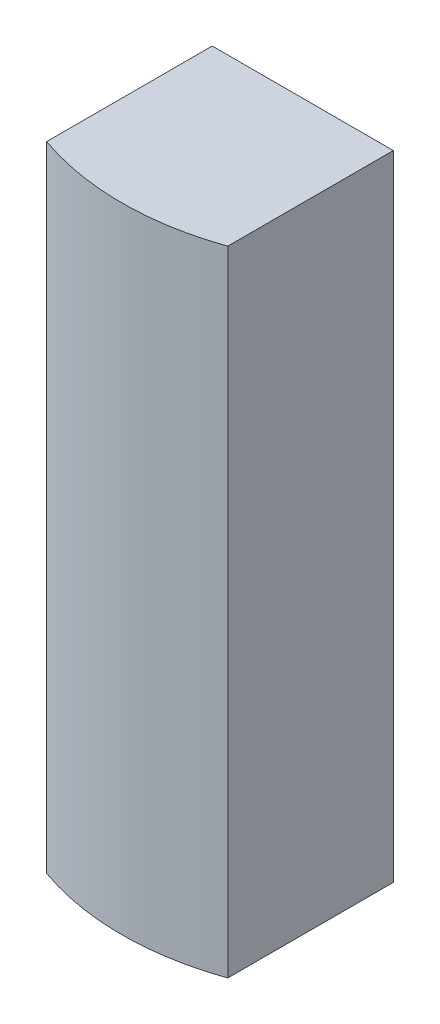
ISO-10303-21;
HEADER;
FILE_DESCRIPTION(('STEP AP214'),'2;1');
FILE_NAME('part.step','',(''),(''),'','','');
FILE_SCHEMA(('AUTOMOTIVE_DESIGN { 1 0 10303 214 1 1 1 1 }'));
ENDSEC;
DATA;
#1=APPLICATION_CONTEXT('core data for automotive mechanical design processes');
#2=APPLICATION_PROTOCOL_DEFINITION('international standard','automotive_design',2000,#1);
#3=PRODUCT_CONTEXT('',#1,'mechanical');
#4=PRODUCT('Part','Part','',(#3));
#5=PRODUCT_RELATED_PRODUCT_CATEGORY('part','',(#4));
#6=PRODUCT_DEFINITION_FORMATION('','',#4);
#7=PRODUCT_DEFINITION_CONTEXT('part definition',#1,'design');
#8=PRODUCT_DEFINITION('design','',#6,#7);
#9=PRODUCT_DEFINITION_SHAPE('','',#8);
#10=(LENGTH_UNIT() NAMED_UNIT(*) SI_UNIT(.MILLI.,.METRE.));
#11=(NAMED_UNIT(*) PLANE_ANGLE_UNIT() SI_UNIT($,.RADIAN.));
#12=(NAMED_UNIT(*) SI_UNIT($,.STERADIAN.) SOLID_ANGLE_UNIT());
#13=UNCERTAINTY_MEASURE_WITH_UNIT(LENGTH_MEASURE(1.E-05),#10,'distance_accuracy_value','');
#14=(GEOMETRIC_REPRESENTATION_CONTEXT(3) GLOBAL_UNCERTAINTY_ASSIGNED_CONTEXT((#13)) GLOBAL_UNIT_ASSIGNED_CONTEXT((#10,
#11,#12)) REPRESENTATION_CONTEXT('',''));
#15=CARTESIAN_POINT('',(0.,0.,0.));
#16=DIRECTION('',(0.,0.,1.));
#17=DIRECTION('',(1.,0.,0.));
#18=AXIS2_PLACEMENT_3D('',#15,#16,#17);
#19=CARTESIAN_POINT('',(-20.,140.,0.));
#20=DIRECTION('',(1.,0.,0.));
#21=DIRECTION('',(0.,0.,-1.));
#22=AXIS2_PLACEMENT_3D('',#19,#20,#21);
#23=PLANE('',#22);
#24=DIRECTION('',(0.,0.,1.));
#25=VECTOR('',#24,1.);
#26=CARTESIAN_POINT('',(-20.,0.,0.));
#27=LINE('',#26,#25);
#28=CARTESIAN_POINT('',(-20.,0.,20.));
#29=VERTEX_POINT('',#28);
#30=CARTESIAN_POINT('',(-20.,0.,56.5685424949238));
#31=VERTEX_POINT('',#30);
#32=EDGE_CURVE('E100',#29,#31,#27,.T.);
#33=ORIENTED_EDGE('',*,*,#32,.T.);
#34=DIRECTION('',(0.,-1.,0.));
#35=VECTOR('',#34,1.);
#36=CARTESIAN_POINT('',(-20.,140.,56.5685424949238));
#37=LINE('',#36,#35);
#38=CARTESIAN_POINT('',(-20.,140.,56.5685424949238));
#39=VERTEX_POINT('',#38);
#40=EDGE_CURVE('E11',#39,#31,#37,.T.);
#41=ORIENTED_EDGE('',*,*,#40,.F.);
#42=DIRECTION('',(0.,0.,1.));
#43=VECTOR('',#42,1.);
#44=CARTESIAN_POINT('',(-20.,140.,0.));
#45=LINE('',#44,#43);
#46=CARTESIAN_POINT('',(-20.,140.,20.));
#47=VERTEX_POINT('',#46);
#48=EDGE_CURVE('E86',#47,#39,#45,.T.);
#49=ORIENTED_EDGE('',*,*,#48,.F.);
#50=DIRECTION('',(0.,-1.,0.));
#51=VECTOR('',#50,1.);
#52=CARTESIAN_POINT('',(-20.,140.,20.));
#53=LINE('',#52,#51);
#54=EDGE_CURVE('E53',#47,#29,#53,.T.);
#55=ORIENTED_EDGE('',*,*,#54,.T.);
#56=EDGE_LOOP('',(#33,#41,#49,#55));
#57=FACE_BOUND('',#56,.T.);
#58=ADVANCED_FACE('F37',(#57),#23,.F.);
#59=CARTESIAN_POINT('',(0.,140.,0.));
#60=DIRECTION('',(0.,-1.,0.));
#61=DIRECTION('',(0.,0.,-1.));
#62=AXIS2_PLACEMENT_3D('',#59,#60,#61);
#63=CYLINDRICAL_SURFACE('',#62,60.);
#64=CARTESIAN_POINT('',(0.,0.,0.));
#65=DIRECTION('',(0.,1.,0.));
#66=DIRECTION('',(0.,0.,1.));
#67=AXIS2_PLACEMENT_3D('',#64,#65,#66);
#68=CIRCLE('',#67,60.);
#69=CARTESIAN_POINT('',(20.,0.,56.5685424949238));
#70=VERTEX_POINT('',#69);
#71=EDGE_CURVE('E91',#31,#70,#68,.T.);
#72=ORIENTED_EDGE('',*,*,#71,.T.);
#73=DIRECTION('',(0.,-1.,0.));
#74=VECTOR('',#73,1.);
#75=CARTESIAN_POINT('',(20.,140.,56.5685424949238));
#76=LINE('',#75,#74);
#77=CARTESIAN_POINT('',(20.,140.,56.5685424949238));
#78=VERTEX_POINT('',#77);
#79=EDGE_CURVE('E45',#78,#70,#76,.T.);
#80=ORIENTED_EDGE('',*,*,#79,.F.);
#81=CARTESIAN_POINT('',(0.,140.,0.));
#82=DIRECTION('',(0.,1.,0.));
#83=DIRECTION('',(0.,0.,1.));
#84=AXIS2_PLACEMENT_3D('',#81,#82,#83);
#85=CIRCLE('',#84,60.);
#86=EDGE_CURVE('E78',#39,#78,#85,.T.);
#87=ORIENTED_EDGE('',*,*,#86,.F.);
#88=ORIENTED_EDGE('',*,*,#40,.T.);
#89=EDGE_LOOP('',(#72,#80,#87,#88));
#90=FACE_BOUND('',#89,.T.);
#91=ADVANCED_FACE('F90',(#90),#63,.T.);
#92=CARTESIAN_POINT('',(20.,140.,0.));
#93=DIRECTION('',(1.,0.,0.));
#94=DIRECTION('',(0.,0.,-1.));
#95=AXIS2_PLACEMENT_3D('',#92,#93,#94);
#96=PLANE('',#95);
#97=DIRECTION('',(0.,0.,1.));
#98=VECTOR('',#97,1.);
#99=CARTESIAN_POINT('',(20.,0.,0.));
#100=LINE('',#99,#98);
#101=CARTESIAN_POINT('',(20.,0.,20.));
#102=VERTEX_POINT('',#101);
#103=EDGE_CURVE('E103',#102,#70,#100,.T.);
#104=ORIENTED_EDGE('',*,*,#103,.F.);
#105=DIRECTION('',(0.,-1.,0.));
#106=VECTOR('',#105,1.);
#107=CARTESIAN_POINT('',(20.,140.,20.));
#108=LINE('',#107,#106);
#109=CARTESIAN_POINT('',(20.,140.,20.));
#110=VERTEX_POINT('',#109);
#111=EDGE_CURVE('E67',#110,#102,#108,.T.);
#112=ORIENTED_EDGE('',*,*,#111,.F.);
#113=DIRECTION('',(0.,0.,1.));
#114=VECTOR('',#113,1.);
#115=CARTESIAN_POINT('',(20.,140.,0.));
#116=LINE('',#115,#114);
#117=EDGE_CURVE('E85',#110,#78,#116,.T.);
#118=ORIENTED_EDGE('',*,*,#117,.T.);
#119=ORIENTED_EDGE('',*,*,#79,.T.);
#120=EDGE_LOOP('',(#104,#112,#118,#119));
#121=FACE_BOUND('',#120,.T.);
#122=ADVANCED_FACE('F94',(#121),#96,.T.);
#123=CARTESIAN_POINT('',(0.,140.,20.));
#124=DIRECTION('',(0.,0.,-1.));
#125=DIRECTION('',(-1.,0.,0.));
#126=AXIS2_PLACEMENT_3D('',#123,#124,#125);
#127=PLANE('',#126);
#128=DIRECTION('',(1.,0.,0.));
#129=VECTOR('',#128,1.);
#130=CARTESIAN_POINT('',(0.,0.,20.));
#131=LINE('',#130,#129);
#132=EDGE_CURVE('E105',#29,#102,#131,.T.);
#133=ORIENTED_EDGE('',*,*,#132,.F.);
#134=ORIENTED_EDGE('',*,*,#54,.F.);
#135=DIRECTION('',(1.,0.,0.));
#136=VECTOR('',#135,1.);
#137=CARTESIAN_POINT('',(0.,140.,20.));
#138=LINE('',#137,#136);
#139=EDGE_CURVE('E95',#47,#110,#138,.T.);
#140=ORIENTED_EDGE('',*,*,#139,.T.);
#141=ORIENTED_EDGE('',*,*,#111,.T.);
#142=EDGE_LOOP('',(#133,#134,#140,#141));
#143=FACE_BOUND('',#142,.T.);
#144=ADVANCED_FACE('F111',(#143),#127,.T.);
#145=CARTESIAN_POINT('',(0.,140.,0.));
#146=DIRECTION('',(0.,1.,0.));
#147=DIRECTION('',(0.,0.,1.));
#148=AXIS2_PLACEMENT_3D('',#145,#146,#147);
#149=PLANE('',#148);
#150=ORIENTED_EDGE('',*,*,#48,.T.);
#151=ORIENTED_EDGE('',*,*,#86,.T.);
#152=ORIENTED_EDGE('',*,*,#117,.F.);
#153=ORIENTED_EDGE('',*,*,#139,.F.);
#154=EDGE_LOOP('',(#150,#151,#152,#153));
#155=FACE_BOUND('',#154,.T.);
#156=ADVANCED_FACE('F82',(#155),#149,.T.);
#157=CARTESIAN_POINT('',(0.,0.,0.));
#158=DIRECTION('',(0.,1.,0.));
#159=DIRECTION('',(0.,0.,1.));
#160=AXIS2_PLACEMENT_3D('',#157,#158,#159);
#161=PLANE('',#160);
#162=ORIENTED_EDGE('',*,*,#32,.F.);
#163=ORIENTED_EDGE('',*,*,#132,.T.);
#164=ORIENTED_EDGE('',*,*,#103,.T.);
#165=ORIENTED_EDGE('',*,*,#71,.F.);
#166=EDGE_LOOP('',(#162,#163,#164,#165));
#167=FACE_BOUND('',#166,.T.);
#168=ADVANCED_FACE('F110',(#167),#161,.F.);
#169=CLOSED_SHELL('',(#58,#91,#122,#144,#156,#168));
#170=MANIFOLD_SOLID_BREP('B2',#169);
#171=ADVANCED_BREP_SHAPE_REPRESENTATION('',(#18,#170),#14);
#172=SHAPE_DEFINITION_REPRESENTATION(#9,#171);
ENDSEC;
END-ISO-10303-21;
